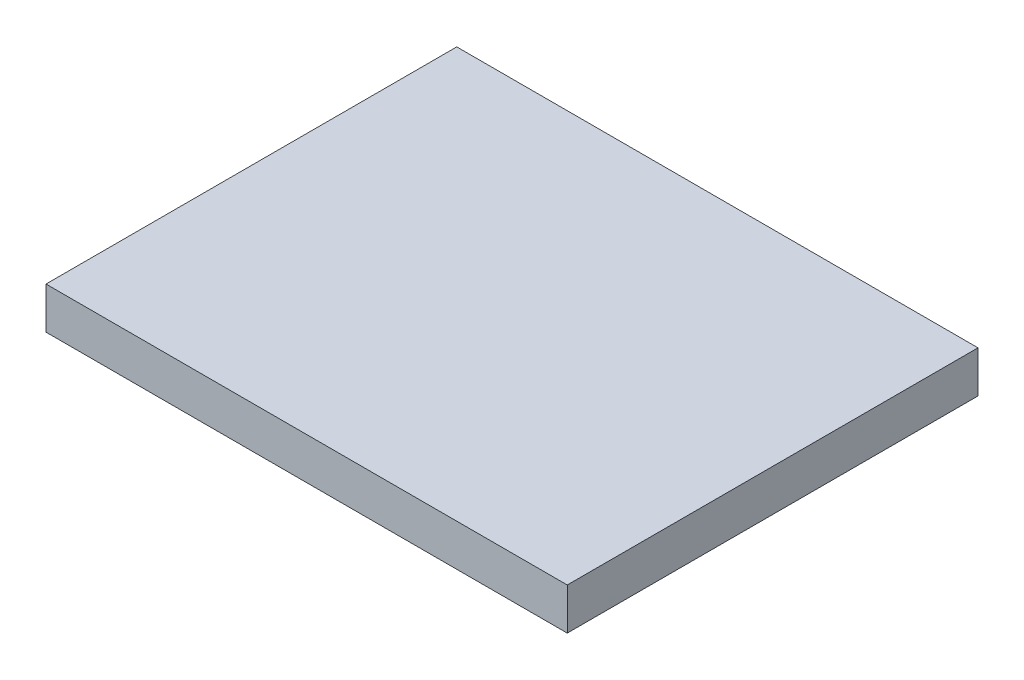
ISO-10303-21;
HEADER;
FILE_DESCRIPTION(('STEP AP214'),'2;1');
FILE_NAME('part.step','',(''),(''),'','','');
FILE_SCHEMA(('AUTOMOTIVE_DESIGN { 1 0 10303 214 1 1 1 1 }'));
ENDSEC;
DATA;
#1=APPLICATION_CONTEXT('core data for automotive mechanical design processes');
#2=APPLICATION_PROTOCOL_DEFINITION('international standard','automotive_design',2000,#1);
#3=PRODUCT_CONTEXT('',#1,'mechanical');
#4=PRODUCT('Part','Part','',(#3));
#5=PRODUCT_RELATED_PRODUCT_CATEGORY('part','',(#4));
#6=PRODUCT_DEFINITION_FORMATION('','',#4);
#7=PRODUCT_DEFINITION_CONTEXT('part definition',#1,'design');
#8=PRODUCT_DEFINITION('design','',#6,#7);
#9=PRODUCT_DEFINITION_SHAPE('','',#8);
#10=(LENGTH_UNIT() NAMED_UNIT(*) SI_UNIT(.MILLI.,.METRE.));
#11=(NAMED_UNIT(*) PLANE_ANGLE_UNIT() SI_UNIT($,.RADIAN.));
#12=(NAMED_UNIT(*) SI_UNIT($,.STERADIAN.) SOLID_ANGLE_UNIT());
#13=UNCERTAINTY_MEASURE_WITH_UNIT(LENGTH_MEASURE(1.E-05),#10,'distance_accuracy_value','');
#14=(GEOMETRIC_REPRESENTATION_CONTEXT(3) GLOBAL_UNCERTAINTY_ASSIGNED_CONTEXT((#13)) GLOBAL_UNIT_ASSIGNED_CONTEXT((#10,
#11,#12)) REPRESENTATION_CONTEXT('',''));
#15=CARTESIAN_POINT('',(0.,0.,0.));
#16=DIRECTION('',(0.,0.,1.));
#17=DIRECTION('',(1.,0.,0.));
#18=AXIS2_PLACEMENT_3D('',#15,#16,#17);
#19=CARTESIAN_POINT('',(230.,0.,-20.0000000000001));
#20=DIRECTION('',(0.,-1.,0.));
#21=DIRECTION('',(0.,0.,-1.));
#22=AXIS2_PLACEMENT_3D('',#19,#20,#21);
#23=CYLINDRICAL_SURFACE('',#22,5.);
#24=CARTESIAN_POINT('',(230.,-9.99999999999999,-20.0000000000001));
#25=DIRECTION('',(0.,-1.,0.));
#26=DIRECTION('',(0.,0.,-1.));
#27=AXIS2_PLACEMENT_3D('',#24,#25,#26);
#28=CIRCLE('',#27,5.);
#29=CARTESIAN_POINT('',(230.,-9.99999999999999,-25.0000000000001));
#30=VERTEX_POINT('',#29);
#31=EDGE_CURVE('E9',#30,#30,#28,.T.);
#32=ORIENTED_EDGE('',*,*,#31,.F.);
#33=EDGE_LOOP('',(#32));
#34=FACE_BOUND('',#33,.T.);
#35=CARTESIAN_POINT('',(230.,0.,-20.0000000000001));
#36=DIRECTION('',(0.,1.,0.));
#37=DIRECTION('',(1.,0.,0.));
#38=AXIS2_PLACEMENT_3D('',#35,#36,#37);
#39=CIRCLE('',#38,5.);
#40=CARTESIAN_POINT('',(235.,0.,-20.0000000000001));
#41=VERTEX_POINT('',#40);
#42=EDGE_CURVE('E75',#41,#41,#39,.T.);
#43=ORIENTED_EDGE('',*,*,#42,.F.);
#44=EDGE_LOOP('',(#43));
#45=FACE_BOUND('',#44,.T.);
#46=ADVANCED_FACE('F15',(#34,#45),#23,.T.);
#47=CARTESIAN_POINT('',(230.,-9.99999999999999,-20.0000000000001));
#48=DIRECTION('',(0.,-1.,0.));
#49=DIRECTION('',(1.,0.,0.));
#50=AXIS2_PLACEMENT_3D('',#47,#48,#49);
#51=PLANE('',#50);
#52=ORIENTED_EDGE('',*,*,#31,.T.);
#53=EDGE_LOOP('',(#52));
#54=FACE_BOUND('',#53,.T.);
#55=ADVANCED_FACE('F114',(#54),#51,.T.);
#56=CARTESIAN_POINT('',(20.,0.,-20.));
#57=DIRECTION('',(0.,-1.,0.));
#58=DIRECTION('',(0.,0.,-1.));
#59=AXIS2_PLACEMENT_3D('',#56,#57,#58);
#60=CYLINDRICAL_SURFACE('',#59,5.);
#61=CARTESIAN_POINT('',(20.,-10.,-20.));
#62=DIRECTION('',(0.,-1.,0.));
#63=DIRECTION('',(0.,0.,-1.));
#64=AXIS2_PLACEMENT_3D('',#61,#62,#63);
#65=CIRCLE('',#64,5.);
#66=CARTESIAN_POINT('',(20.,-10.,-25.));
#67=VERTEX_POINT('',#66);
#68=EDGE_CURVE('E24',#67,#67,#65,.T.);
#69=ORIENTED_EDGE('',*,*,#68,.F.);
#70=EDGE_LOOP('',(#69));
#71=FACE_BOUND('',#70,.T.);
#72=CARTESIAN_POINT('',(20.,0.,-20.));
#73=DIRECTION('',(0.,1.,0.));
#74=DIRECTION('',(1.,0.,0.));
#75=AXIS2_PLACEMENT_3D('',#72,#73,#74);
#76=CIRCLE('',#75,5.);
#77=CARTESIAN_POINT('',(25.,0.,-20.));
#78=VERTEX_POINT('',#77);
#79=EDGE_CURVE('E127',#78,#78,#76,.T.);
#80=ORIENTED_EDGE('',*,*,#79,.F.);
#81=EDGE_LOOP('',(#80));
#82=FACE_BOUND('',#81,.T.);
#83=ADVANCED_FACE('F119',(#71,#82),#60,.T.);
#84=CARTESIAN_POINT('',(20.,-10.,-20.));
#85=DIRECTION('',(0.,-1.,0.));
#86=DIRECTION('',(1.,0.,0.));
#87=AXIS2_PLACEMENT_3D('',#84,#85,#86);
#88=PLANE('',#87);
#89=ORIENTED_EDGE('',*,*,#68,.T.);
#90=EDGE_LOOP('',(#89));
#91=FACE_BOUND('',#90,.T.);
#92=ADVANCED_FACE('F160',(#91),#88,.T.);
#93=CARTESIAN_POINT('',(19.9999999999999,0.,-177.));
#94=DIRECTION('',(0.,-1.,0.));
#95=DIRECTION('',(0.,0.,-1.));
#96=AXIS2_PLACEMENT_3D('',#93,#94,#95);
#97=CYLINDRICAL_SURFACE('',#96,5.00000000000001);
#98=CARTESIAN_POINT('',(19.9999999999999,-10.,-177.));
#99=DIRECTION('',(0.,-1.,0.));
#100=DIRECTION('',(0.,0.,-1.));
#101=AXIS2_PLACEMENT_3D('',#98,#99,#100);
#102=CIRCLE('',#101,5.00000000000001);
#103=CARTESIAN_POINT('',(19.9999999999999,-10.,-182.));
#104=VERTEX_POINT('',#103);
#105=EDGE_CURVE('E133',#104,#104,#102,.T.);
#106=ORIENTED_EDGE('',*,*,#105,.F.);
#107=EDGE_LOOP('',(#106));
#108=FACE_BOUND('',#107,.T.);
#109=CARTESIAN_POINT('',(19.9999999999999,0.,-177.));
#110=DIRECTION('',(0.,1.,0.));
#111=DIRECTION('',(1.,0.,0.));
#112=AXIS2_PLACEMENT_3D('',#109,#110,#111);
#113=CIRCLE('',#112,5.00000000000001);
#114=CARTESIAN_POINT('',(25.,0.,-177.));
#115=VERTEX_POINT('',#114);
#116=EDGE_CURVE('E86',#115,#115,#113,.T.);
#117=ORIENTED_EDGE('',*,*,#116,.F.);
#118=EDGE_LOOP('',(#117));
#119=FACE_BOUND('',#118,.T.);
#120=ADVANCED_FACE('F162',(#108,#119),#97,.T.);
#121=CARTESIAN_POINT('',(19.9999999999999,-10.,-177.));
#122=DIRECTION('',(0.,-1.,0.));
#123=DIRECTION('',(1.,0.,0.));
#124=AXIS2_PLACEMENT_3D('',#121,#122,#123);
#125=PLANE('',#124);
#126=ORIENTED_EDGE('',*,*,#105,.T.);
#127=EDGE_LOOP('',(#126));
#128=FACE_BOUND('',#127,.T.);
#129=ADVANCED_FACE('F143',(#128),#125,.T.);
#130=CARTESIAN_POINT('',(230.,0.,-177.));
#131=DIRECTION('',(0.,-1.,0.));
#132=DIRECTION('',(0.,0.,-1.));
#133=AXIS2_PLACEMENT_3D('',#130,#131,#132);
#134=CYLINDRICAL_SURFACE('',#133,5.);
#135=CARTESIAN_POINT('',(230.,-9.99999999999999,-177.));
#136=DIRECTION('',(0.,-1.,0.));
#137=DIRECTION('',(0.,0.,-1.));
#138=AXIS2_PLACEMENT_3D('',#135,#136,#137);
#139=CIRCLE('',#138,5.);
#140=CARTESIAN_POINT('',(230.,-9.99999999999999,-182.));
#141=VERTEX_POINT('',#140);
#142=EDGE_CURVE('E93',#141,#141,#139,.T.);
#143=ORIENTED_EDGE('',*,*,#142,.F.);
#144=EDGE_LOOP('',(#143));
#145=FACE_BOUND('',#144,.T.);
#146=CARTESIAN_POINT('',(230.,0.,-177.));
#147=DIRECTION('',(0.,1.,0.));
#148=DIRECTION('',(1.,0.,0.));
#149=AXIS2_PLACEMENT_3D('',#146,#147,#148);
#150=CIRCLE('',#149,5.);
#151=CARTESIAN_POINT('',(235.,0.,-177.));
#152=VERTEX_POINT('',#151);
#153=EDGE_CURVE('E84',#152,#152,#150,.T.);
#154=ORIENTED_EDGE('',*,*,#153,.F.);
#155=EDGE_LOOP('',(#154));
#156=FACE_BOUND('',#155,.T.);
#157=ADVANCED_FACE('F110',(#145,#156),#134,.T.);
#158=CARTESIAN_POINT('',(230.,-9.99999999999999,-177.));
#159=DIRECTION('',(0.,-1.,0.));
#160=DIRECTION('',(1.,0.,0.));
#161=AXIS2_PLACEMENT_3D('',#158,#159,#160);
#162=PLANE('',#161);
#163=ORIENTED_EDGE('',*,*,#142,.T.);
#164=EDGE_LOOP('',(#163));
#165=FACE_BOUND('',#164,.T.);
#166=ADVANCED_FACE('F102',(#165),#162,.T.);
#167=CARTESIAN_POINT('',(250.,0.,0.));
#168=DIRECTION('',(1.,0.,0.));
#169=DIRECTION('',(0.,0.,-1.));
#170=AXIS2_PLACEMENT_3D('',#167,#168,#169);
#171=PLANE('',#170);
#172=DIRECTION('',(0.,0.,1.));
#173=VECTOR('',#172,1.);
#174=CARTESIAN_POINT('',(250.,0.,-197.));
#175=LINE('',#174,#173);
#176=CARTESIAN_POINT('',(250.,0.,-197.));
#177=VERTEX_POINT('',#176);
#178=CARTESIAN_POINT('',(250.,0.,0.));
#179=VERTEX_POINT('',#178);
#180=EDGE_CURVE('E33',#177,#179,#175,.T.);
#181=ORIENTED_EDGE('',*,*,#180,.F.);
#182=DIRECTION('',(0.,1.,0.));
#183=VECTOR('',#182,1.);
#184=CARTESIAN_POINT('',(250.,0.,-197.));
#185=LINE('',#184,#183);
#186=CARTESIAN_POINT('',(250.,20.,-197.));
#187=VERTEX_POINT('',#186);
#188=EDGE_CURVE('E91',#177,#187,#185,.T.);
#189=ORIENTED_EDGE('',*,*,#188,.T.);
#190=DIRECTION('',(0.,0.,-1.));
#191=VECTOR('',#190,1.);
#192=CARTESIAN_POINT('',(250.,20.,-197.));
#193=LINE('',#192,#191);
#194=CARTESIAN_POINT('',(250.,20.,0.));
#195=VERTEX_POINT('',#194);
#196=EDGE_CURVE('E78',#195,#187,#193,.T.);
#197=ORIENTED_EDGE('',*,*,#196,.F.);
#198=DIRECTION('',(0.,1.,0.));
#199=VECTOR('',#198,1.);
#200=CARTESIAN_POINT('',(250.,0.,0.));
#201=LINE('',#200,#199);
#202=EDGE_CURVE('E94',#179,#195,#201,.T.);
#203=ORIENTED_EDGE('',*,*,#202,.F.);
#204=EDGE_LOOP('',(#181,#189,#197,#203));
#205=FACE_BOUND('',#204,.T.);
#206=ADVANCED_FACE('F100',(#205),#171,.T.);
#207=CARTESIAN_POINT('',(0.,0.,0.));
#208=DIRECTION('',(0.,0.,1.));
#209=DIRECTION('',(1.,0.,0.));
#210=AXIS2_PLACEMENT_3D('',#207,#208,#209);
#211=PLANE('',#210);
#212=DIRECTION('',(-1.,0.,0.));
#213=VECTOR('',#212,1.);
#214=CARTESIAN_POINT('',(250.,0.,0.));
#215=LINE('',#214,#213);
#216=CARTESIAN_POINT('',(0.,0.,0.));
#217=VERTEX_POINT('',#216);
#218=EDGE_CURVE('E79',#179,#217,#215,.T.);
#219=ORIENTED_EDGE('',*,*,#218,.F.);
#220=ORIENTED_EDGE('',*,*,#202,.T.);
#221=DIRECTION('',(1.,0.,0.));
#222=VECTOR('',#221,1.);
#223=CARTESIAN_POINT('',(250.,20.,0.));
#224=LINE('',#223,#222);
#225=CARTESIAN_POINT('',(0.,20.,0.));
#226=VERTEX_POINT('',#225);
#227=EDGE_CURVE('E69',#226,#195,#224,.T.);
#228=ORIENTED_EDGE('',*,*,#227,.F.);
#229=DIRECTION('',(0.,1.,0.));
#230=VECTOR('',#229,1.);
#231=CARTESIAN_POINT('',(0.,0.,0.));
#232=LINE('',#231,#230);
#233=EDGE_CURVE('E65',#217,#226,#232,.T.);
#234=ORIENTED_EDGE('',*,*,#233,.F.);
#235=EDGE_LOOP('',(#219,#220,#228,#234));
#236=FACE_BOUND('',#235,.T.);
#237=ADVANCED_FACE('F99',(#236),#211,.T.);
#238=CARTESIAN_POINT('',(0.,0.,-197.));
#239=DIRECTION('',(-1.,0.,0.));
#240=DIRECTION('',(0.,0.,1.));
#241=AXIS2_PLACEMENT_3D('',#238,#239,#240);
#242=PLANE('',#241);
#243=DIRECTION('',(0.,0.,-1.));
#244=VECTOR('',#243,1.);
#245=CARTESIAN_POINT('',(0.,0.,0.));
#246=LINE('',#245,#244);
#247=CARTESIAN_POINT('',(0.,0.,-197.));
#248=VERTEX_POINT('',#247);
#249=EDGE_CURVE('E53',#217,#248,#246,.T.);
#250=ORIENTED_EDGE('',*,*,#249,.F.);
#251=ORIENTED_EDGE('',*,*,#233,.T.);
#252=DIRECTION('',(0.,0.,1.));
#253=VECTOR('',#252,1.);
#254=CARTESIAN_POINT('',(0.,20.,0.));
#255=LINE('',#254,#253);
#256=CARTESIAN_POINT('',(0.,20.,-197.));
#257=VERTEX_POINT('',#256);
#258=EDGE_CURVE('E59',#257,#226,#255,.T.);
#259=ORIENTED_EDGE('',*,*,#258,.F.);
#260=DIRECTION('',(0.,1.,0.));
#261=VECTOR('',#260,1.);
#262=CARTESIAN_POINT('',(0.,0.,-197.));
#263=LINE('',#262,#261);
#264=EDGE_CURVE('E62',#248,#257,#263,.T.);
#265=ORIENTED_EDGE('',*,*,#264,.F.);
#266=EDGE_LOOP('',(#250,#251,#259,#265));
#267=FACE_BOUND('',#266,.T.);
#268=ADVANCED_FACE('F61',(#267),#242,.T.);
#269=CARTESIAN_POINT('',(250.,0.,-197.));
#270=DIRECTION('',(0.,0.,-1.));
#271=DIRECTION('',(-1.,0.,0.));
#272=AXIS2_PLACEMENT_3D('',#269,#270,#271);
#273=PLANE('',#272);
#274=DIRECTION('',(1.,0.,0.));
#275=VECTOR('',#274,1.);
#276=CARTESIAN_POINT('',(0.,0.,-197.));
#277=LINE('',#276,#275);
#278=EDGE_CURVE('E74',#248,#177,#277,.T.);
#279=ORIENTED_EDGE('',*,*,#278,.F.);
#280=ORIENTED_EDGE('',*,*,#264,.T.);
#281=DIRECTION('',(-1.,0.,0.));
#282=VECTOR('',#281,1.);
#283=CARTESIAN_POINT('',(0.,20.,-197.));
#284=LINE('',#283,#282);
#285=EDGE_CURVE('E18',#187,#257,#284,.T.);
#286=ORIENTED_EDGE('',*,*,#285,.F.);
#287=ORIENTED_EDGE('',*,*,#188,.F.);
#288=EDGE_LOOP('',(#279,#280,#286,#287));
#289=FACE_BOUND('',#288,.T.);
#290=ADVANCED_FACE('F73',(#289),#273,.T.);
#291=CARTESIAN_POINT('',(125.,0.,-98.5000000000001));
#292=DIRECTION('',(0.,1.,0.));
#293=DIRECTION('',(-1.,0.,0.));
#294=AXIS2_PLACEMENT_3D('',#291,#292,#293);
#295=PLANE('',#294);
#296=ORIENTED_EDGE('',*,*,#42,.T.);
#297=EDGE_LOOP('',(#296));
#298=FACE_BOUND('',#297,.T.);
#299=ORIENTED_EDGE('',*,*,#79,.T.);
#300=EDGE_LOOP('',(#299));
#301=FACE_BOUND('',#300,.T.);
#302=ORIENTED_EDGE('',*,*,#116,.T.);
#303=EDGE_LOOP('',(#302));
#304=FACE_BOUND('',#303,.T.);
#305=ORIENTED_EDGE('',*,*,#153,.T.);
#306=EDGE_LOOP('',(#305));
#307=FACE_BOUND('',#306,.T.);
#308=ORIENTED_EDGE('',*,*,#278,.T.);
#309=ORIENTED_EDGE('',*,*,#180,.T.);
#310=ORIENTED_EDGE('',*,*,#218,.T.);
#311=ORIENTED_EDGE('',*,*,#249,.T.);
#312=EDGE_LOOP('',(#308,#309,#310,#311));
#313=FACE_BOUND('',#312,.T.);
#314=ADVANCED_FACE('F147',(#298,#301,#304,#307,#313),#295,.F.);
#315=CARTESIAN_POINT('',(125.,20.,-98.5000000000001));
#316=DIRECTION('',(0.,1.,0.));
#317=DIRECTION('',(0.,0.,1.));
#318=AXIS2_PLACEMENT_3D('',#315,#316,#317);
#319=PLANE('',#318);
#320=ORIENTED_EDGE('',*,*,#285,.T.);
#321=ORIENTED_EDGE('',*,*,#258,.T.);
#322=ORIENTED_EDGE('',*,*,#227,.T.);
#323=ORIENTED_EDGE('',*,*,#196,.T.);
#324=EDGE_LOOP('',(#320,#321,#322,#323));
#325=FACE_BOUND('',#324,.T.);
#326=ADVANCED_FACE('F77',(#325),#319,.T.);
#327=CLOSED_SHELL('',(#46,#55,#83,#92,#120,#129,#157,#166,#206,#237,#268,#290,#314,#326));
#328=MANIFOLD_SOLID_BREP('B1',#327);
#329=ADVANCED_BREP_SHAPE_REPRESENTATION('',(#18,#328),#14);
#330=SHAPE_DEFINITION_REPRESENTATION(#9,#329);
ENDSEC;
END-ISO-10303-21;
